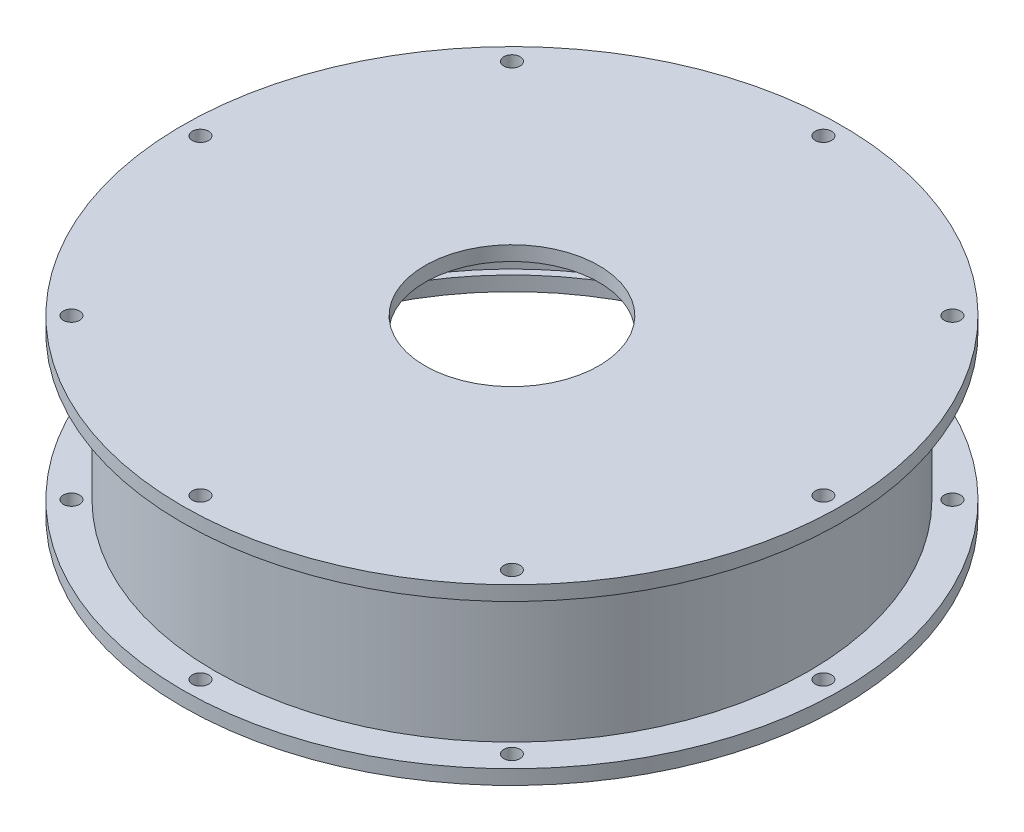
ISO-10303-21;
HEADER;
FILE_DESCRIPTION(('STEP AP214'),'2;1');
FILE_NAME('part.step','',(''),(''),'','','');
FILE_SCHEMA(('AUTOMOTIVE_DESIGN { 1 0 10303 214 1 1 1 1 }'));
ENDSEC;
DATA;
#1=APPLICATION_CONTEXT('core data for automotive mechanical design processes');
#2=APPLICATION_PROTOCOL_DEFINITION('international standard','automotive_design',2000,#1);
#3=PRODUCT_CONTEXT('',#1,'mechanical');
#4=PRODUCT('Part','Part','',(#3));
#5=PRODUCT_RELATED_PRODUCT_CATEGORY('part','',(#4));
#6=PRODUCT_DEFINITION_FORMATION('','',#4);
#7=PRODUCT_DEFINITION_CONTEXT('part definition',#1,'design');
#8=PRODUCT_DEFINITION('design','',#6,#7);
#9=PRODUCT_DEFINITION_SHAPE('','',#8);
#10=(LENGTH_UNIT() NAMED_UNIT(*) SI_UNIT(.MILLI.,.METRE.));
#11=(NAMED_UNIT(*) PLANE_ANGLE_UNIT() SI_UNIT($,.RADIAN.));
#12=(NAMED_UNIT(*) SI_UNIT($,.STERADIAN.) SOLID_ANGLE_UNIT());
#13=UNCERTAINTY_MEASURE_WITH_UNIT(LENGTH_MEASURE(1.E-05),#10,'distance_accuracy_value','');
#14=(GEOMETRIC_REPRESENTATION_CONTEXT(3) GLOBAL_UNCERTAINTY_ASSIGNED_CONTEXT((#13)) GLOBAL_UNIT_ASSIGNED_CONTEXT((#10,
#11,#12)) REPRESENTATION_CONTEXT('',''));
#15=CARTESIAN_POINT('',(0.,0.,0.));
#16=DIRECTION('',(0.,0.,1.));
#17=DIRECTION('',(1.,0.,0.));
#18=AXIS2_PLACEMENT_3D('',#15,#16,#17);
#19=CARTESIAN_POINT('',(0.,6.35,0.));
#20=DIRECTION('',(0.,-1.,0.));
#21=DIRECTION('',(0.,0.,-1.));
#22=AXIS2_PLACEMENT_3D('',#19,#20,#21);
#23=CYLINDRICAL_SURFACE('',#22,144.4625);
#24=CARTESIAN_POINT('',(0.,6.35,0.));
#25=DIRECTION('',(0.,1.,0.));
#26=DIRECTION('',(0.,0.,1.));
#27=AXIS2_PLACEMENT_3D('',#24,#25,#26);
#28=CIRCLE('',#27,144.4625);
#29=CARTESIAN_POINT('',(0.,6.35,144.4625));
#30=VERTEX_POINT('',#29);
#31=EDGE_CURVE('E52',#30,#30,#28,.T.);
#32=ORIENTED_EDGE('',*,*,#31,.F.);
#33=EDGE_LOOP('',(#32));
#34=FACE_BOUND('',#33,.T.);
#35=CARTESIAN_POINT('',(0.,0.,0.));
#36=DIRECTION('',(0.,1.,0.));
#37=DIRECTION('',(0.,0.,1.));
#38=AXIS2_PLACEMENT_3D('',#35,#36,#37);
#39=CIRCLE('',#38,144.4625);
#40=CARTESIAN_POINT('',(0.,0.,144.4625));
#41=VERTEX_POINT('',#40);
#42=EDGE_CURVE('E59',#41,#41,#39,.T.);
#43=ORIENTED_EDGE('',*,*,#42,.T.);
#44=EDGE_LOOP('',(#43));
#45=FACE_BOUND('',#44,.T.);
#46=ADVANCED_FACE('F45',(#34,#45),#23,.T.);
#47=CARTESIAN_POINT('',(0.,6.35,0.));
#48=DIRECTION('',(0.,1.,0.));
#49=DIRECTION('',(0.,0.,1.));
#50=AXIS2_PLACEMENT_3D('',#47,#48,#49);
#51=PLANE('',#50);
#52=CARTESIAN_POINT('',(0.,6.35,0.));
#53=DIRECTION('',(0.,1.,0.));
#54=DIRECTION('',(0.,0.,1.));
#55=AXIS2_PLACEMENT_3D('',#52,#53,#54);
#56=CIRCLE('',#55,130.175);
#57=CARTESIAN_POINT('',(0.,6.35,130.175));
#58=VERTEX_POINT('',#57);
#59=EDGE_CURVE('E117',#58,#58,#56,.T.);
#60=ORIENTED_EDGE('',*,*,#59,.F.);
#61=EDGE_LOOP('',(#60));
#62=FACE_BOUND('',#61,.T.);
#63=CARTESIAN_POINT('',(0.,6.35,-136.525));
#64=DIRECTION('',(0.,1.,0.));
#65=DIRECTION('',(0.,0.,1.));
#66=AXIS2_PLACEMENT_3D('',#63,#64,#65);
#67=CIRCLE('',#66,3.57124);
#68=CARTESIAN_POINT('',(0.,6.35,-132.95376));
#69=VERTEX_POINT('',#68);
#70=EDGE_CURVE('E113',#69,#69,#67,.T.);
#71=ORIENTED_EDGE('',*,*,#70,.F.);
#72=EDGE_LOOP('',(#71));
#73=FACE_BOUND('',#72,.T.);
#74=CARTESIAN_POINT('',(96.5377533014934,6.35,-96.5377533014934));
#75=DIRECTION('',(0.,1.,0.));
#76=DIRECTION('',(0.,0.,1.));
#77=AXIS2_PLACEMENT_3D('',#74,#75,#76);
#78=CIRCLE('',#77,3.57124);
#79=CARTESIAN_POINT('',(96.5377533014934,6.35,-92.9665133014934));
#80=VERTEX_POINT('',#79);
#81=EDGE_CURVE('E107',#80,#80,#78,.T.);
#82=ORIENTED_EDGE('',*,*,#81,.F.);
#83=EDGE_LOOP('',(#82));
#84=FACE_BOUND('',#83,.T.);
#85=CARTESIAN_POINT('',(136.525,6.35,0.));
#86=DIRECTION('',(0.,1.,0.));
#87=DIRECTION('',(0.,0.,1.));
#88=AXIS2_PLACEMENT_3D('',#85,#86,#87);
#89=CIRCLE('',#88,3.57124);
#90=CARTESIAN_POINT('',(136.525,6.35,3.57124));
#91=VERTEX_POINT('',#90);
#92=EDGE_CURVE('E101',#91,#91,#89,.T.);
#93=ORIENTED_EDGE('',*,*,#92,.F.);
#94=EDGE_LOOP('',(#93));
#95=FACE_BOUND('',#94,.T.);
#96=CARTESIAN_POINT('',(96.5377533014934,6.35,96.5377533014934));
#97=DIRECTION('',(0.,1.,0.));
#98=DIRECTION('',(0.,0.,1.));
#99=AXIS2_PLACEMENT_3D('',#96,#97,#98);
#100=CIRCLE('',#99,3.57124);
#101=CARTESIAN_POINT('',(96.5377533014934,6.35,100.108993301493));
#102=VERTEX_POINT('',#101);
#103=EDGE_CURVE('E95',#102,#102,#100,.T.);
#104=ORIENTED_EDGE('',*,*,#103,.F.);
#105=EDGE_LOOP('',(#104));
#106=FACE_BOUND('',#105,.T.);
#107=CARTESIAN_POINT('',(0.,6.35,136.525));
#108=DIRECTION('',(0.,1.,0.));
#109=DIRECTION('',(0.,0.,1.));
#110=AXIS2_PLACEMENT_3D('',#107,#108,#109);
#111=CIRCLE('',#110,3.57124);
#112=CARTESIAN_POINT('',(0.,6.35,140.09624));
#113=VERTEX_POINT('',#112);
#114=EDGE_CURVE('E89',#113,#113,#111,.T.);
#115=ORIENTED_EDGE('',*,*,#114,.F.);
#116=EDGE_LOOP('',(#115));
#117=FACE_BOUND('',#116,.T.);
#118=CARTESIAN_POINT('',(-96.5377533014934,6.35,96.5377533014934));
#119=DIRECTION('',(0.,1.,0.));
#120=DIRECTION('',(0.,0.,1.));
#121=AXIS2_PLACEMENT_3D('',#118,#119,#120);
#122=CIRCLE('',#121,3.57124);
#123=CARTESIAN_POINT('',(-96.5377533014934,6.35,100.108993301493));
#124=VERTEX_POINT('',#123);
#125=EDGE_CURVE('E82',#124,#124,#122,.T.);
#126=ORIENTED_EDGE('',*,*,#125,.F.);
#127=EDGE_LOOP('',(#126));
#128=FACE_BOUND('',#127,.T.);
#129=CARTESIAN_POINT('',(-136.525,6.35,0.));
#130=DIRECTION('',(0.,1.,0.));
#131=DIRECTION('',(0.,0.,1.));
#132=AXIS2_PLACEMENT_3D('',#129,#130,#131);
#133=CIRCLE('',#132,3.57124);
#134=CARTESIAN_POINT('',(-136.525,6.35,3.57124000000003));
#135=VERTEX_POINT('',#134);
#136=EDGE_CURVE('E75',#135,#135,#133,.T.);
#137=ORIENTED_EDGE('',*,*,#136,.F.);
#138=EDGE_LOOP('',(#137));
#139=FACE_BOUND('',#138,.T.);
#140=CARTESIAN_POINT('',(-96.5377533014934,6.35,-96.5377533014934));
#141=DIRECTION('',(0.,1.,0.));
#142=DIRECTION('',(0.,0.,1.));
#143=AXIS2_PLACEMENT_3D('',#140,#141,#142);
#144=CIRCLE('',#143,3.57124);
#145=CARTESIAN_POINT('',(-96.5377533014934,6.35,-92.9665133014934));
#146=VERTEX_POINT('',#145);
#147=EDGE_CURVE('E69',#146,#146,#144,.T.);
#148=ORIENTED_EDGE('',*,*,#147,.F.);
#149=EDGE_LOOP('',(#148));
#150=FACE_BOUND('',#149,.T.);
#151=ORIENTED_EDGE('',*,*,#31,.T.);
#152=EDGE_LOOP('',(#151));
#153=FACE_BOUND('',#152,.T.);
#154=ADVANCED_FACE('F243',(#62,#73,#84,#95,#106,#117,#128,#139,#150,#153),#51,.T.);
#155=CARTESIAN_POINT('',(0.,0.,0.));
#156=DIRECTION('',(0.,1.,0.));
#157=DIRECTION('',(0.,0.,1.));
#158=AXIS2_PLACEMENT_3D('',#155,#156,#157);
#159=PLANE('',#158);
#160=CARTESIAN_POINT('',(0.,0.,0.));
#161=DIRECTION('',(0.,-1.,0.));
#162=DIRECTION('',(0.,0.,-1.));
#163=AXIS2_PLACEMENT_3D('',#160,#161,#162);
#164=CIRCLE('',#163,120.65);
#165=CARTESIAN_POINT('',(0.,0.,-120.65));
#166=VERTEX_POINT('',#165);
#167=EDGE_CURVE('E190',#166,#166,#164,.T.);
#168=ORIENTED_EDGE('',*,*,#167,.F.);
#169=EDGE_LOOP('',(#168));
#170=FACE_BOUND('',#169,.T.);
#171=CARTESIAN_POINT('',(0.,0.,-136.525));
#172=DIRECTION('',(0.,1.,0.));
#173=DIRECTION('',(0.,0.,1.));
#174=AXIS2_PLACEMENT_3D('',#171,#172,#173);
#175=CIRCLE('',#174,3.57124);
#176=CARTESIAN_POINT('',(0.,0.,-132.95376));
#177=VERTEX_POINT('',#176);
#178=EDGE_CURVE('E110',#177,#177,#175,.T.);
#179=ORIENTED_EDGE('',*,*,#178,.T.);
#180=EDGE_LOOP('',(#179));
#181=FACE_BOUND('',#180,.T.);
#182=CARTESIAN_POINT('',(96.5377533014934,0.,-96.5377533014934));
#183=DIRECTION('',(0.,1.,0.));
#184=DIRECTION('',(0.,0.,1.));
#185=AXIS2_PLACEMENT_3D('',#182,#183,#184);
#186=CIRCLE('',#185,3.57124);
#187=CARTESIAN_POINT('',(96.5377533014934,0.,-92.9665133014934));
#188=VERTEX_POINT('',#187);
#189=EDGE_CURVE('E104',#188,#188,#186,.T.);
#190=ORIENTED_EDGE('',*,*,#189,.T.);
#191=EDGE_LOOP('',(#190));
#192=FACE_BOUND('',#191,.T.);
#193=CARTESIAN_POINT('',(136.525,0.,0.));
#194=DIRECTION('',(0.,1.,0.));
#195=DIRECTION('',(0.,0.,1.));
#196=AXIS2_PLACEMENT_3D('',#193,#194,#195);
#197=CIRCLE('',#196,3.57124);
#198=CARTESIAN_POINT('',(136.525,0.,3.57124));
#199=VERTEX_POINT('',#198);
#200=EDGE_CURVE('E98',#199,#199,#197,.T.);
#201=ORIENTED_EDGE('',*,*,#200,.T.);
#202=EDGE_LOOP('',(#201));
#203=FACE_BOUND('',#202,.T.);
#204=CARTESIAN_POINT('',(96.5377533014934,0.,96.5377533014934));
#205=DIRECTION('',(0.,1.,0.));
#206=DIRECTION('',(0.,0.,1.));
#207=AXIS2_PLACEMENT_3D('',#204,#205,#206);
#208=CIRCLE('',#207,3.57124);
#209=CARTESIAN_POINT('',(96.5377533014934,0.,100.108993301493));
#210=VERTEX_POINT('',#209);
#211=EDGE_CURVE('E92',#210,#210,#208,.T.);
#212=ORIENTED_EDGE('',*,*,#211,.T.);
#213=EDGE_LOOP('',(#212));
#214=FACE_BOUND('',#213,.T.);
#215=CARTESIAN_POINT('',(0.,0.,136.525));
#216=DIRECTION('',(0.,1.,0.));
#217=DIRECTION('',(0.,0.,1.));
#218=AXIS2_PLACEMENT_3D('',#215,#216,#217);
#219=CIRCLE('',#218,3.57124);
#220=CARTESIAN_POINT('',(0.,0.,140.09624));
#221=VERTEX_POINT('',#220);
#222=EDGE_CURVE('E86',#221,#221,#219,.T.);
#223=ORIENTED_EDGE('',*,*,#222,.T.);
#224=EDGE_LOOP('',(#223));
#225=FACE_BOUND('',#224,.T.);
#226=CARTESIAN_POINT('',(-96.5377533014934,0.,96.5377533014934));
#227=DIRECTION('',(0.,1.,0.));
#228=DIRECTION('',(0.,0.,1.));
#229=AXIS2_PLACEMENT_3D('',#226,#227,#228);
#230=CIRCLE('',#229,3.57124);
#231=CARTESIAN_POINT('',(-96.5377533014934,0.,100.108993301493));
#232=VERTEX_POINT('',#231);
#233=EDGE_CURVE('E78',#232,#232,#230,.T.);
#234=ORIENTED_EDGE('',*,*,#233,.T.);
#235=EDGE_LOOP('',(#234));
#236=FACE_BOUND('',#235,.T.);
#237=CARTESIAN_POINT('',(-136.525,0.,0.));
#238=DIRECTION('',(0.,1.,0.));
#239=DIRECTION('',(0.,0.,1.));
#240=AXIS2_PLACEMENT_3D('',#237,#238,#239);
#241=CIRCLE('',#240,3.57124);
#242=CARTESIAN_POINT('',(-136.525,0.,3.57124000000003));
#243=VERTEX_POINT('',#242);
#244=EDGE_CURVE('E72',#243,#243,#241,.T.);
#245=ORIENTED_EDGE('',*,*,#244,.T.);
#246=EDGE_LOOP('',(#245));
#247=FACE_BOUND('',#246,.T.);
#248=CARTESIAN_POINT('',(-96.5377533014934,0.,-96.5377533014934));
#249=DIRECTION('',(0.,1.,0.));
#250=DIRECTION('',(0.,0.,1.));
#251=AXIS2_PLACEMENT_3D('',#248,#249,#250);
#252=CIRCLE('',#251,3.57124);
#253=CARTESIAN_POINT('',(-96.5377533014934,0.,-92.9665133014934));
#254=VERTEX_POINT('',#253);
#255=EDGE_CURVE('E65',#254,#254,#252,.T.);
#256=ORIENTED_EDGE('',*,*,#255,.T.);
#257=EDGE_LOOP('',(#256));
#258=FACE_BOUND('',#257,.T.);
#259=ORIENTED_EDGE('',*,*,#42,.F.);
#260=EDGE_LOOP('',(#259));
#261=FACE_BOUND('',#260,.T.);
#262=ADVANCED_FACE('F249',(#170,#181,#192,#203,#214,#225,#236,#247,#258,#261),#159,.F.);
#263=CARTESIAN_POINT('',(-96.5377533014934,6.35,-96.5377533014934));
#264=DIRECTION('',(0.,1.,0.));
#265=DIRECTION('',(0.,0.,1.));
#266=AXIS2_PLACEMENT_3D('',#263,#264,#265);
#267=CYLINDRICAL_SURFACE('',#266,3.57124);
#268=ORIENTED_EDGE('',*,*,#255,.F.);
#269=EDGE_LOOP('',(#268));
#270=FACE_BOUND('',#269,.T.);
#271=ORIENTED_EDGE('',*,*,#147,.T.);
#272=EDGE_LOOP('',(#271));
#273=FACE_BOUND('',#272,.T.);
#274=ADVANCED_FACE('F257',(#270,#273),#267,.F.);
#275=CARTESIAN_POINT('',(-136.525,6.35,0.));
#276=DIRECTION('',(0.,1.,0.));
#277=DIRECTION('',(0.,0.,1.));
#278=AXIS2_PLACEMENT_3D('',#275,#276,#277);
#279=CYLINDRICAL_SURFACE('',#278,3.57124);
#280=ORIENTED_EDGE('',*,*,#244,.F.);
#281=EDGE_LOOP('',(#280));
#282=FACE_BOUND('',#281,.T.);
#283=ORIENTED_EDGE('',*,*,#136,.T.);
#284=EDGE_LOOP('',(#283));
#285=FACE_BOUND('',#284,.T.);
#286=ADVANCED_FACE('F263',(#282,#285),#279,.F.);
#287=CARTESIAN_POINT('',(-96.5377533014934,6.35,96.5377533014934));
#288=DIRECTION('',(0.,1.,0.));
#289=DIRECTION('',(0.,0.,1.));
#290=AXIS2_PLACEMENT_3D('',#287,#288,#289);
#291=CYLINDRICAL_SURFACE('',#290,3.57124);
#292=ORIENTED_EDGE('',*,*,#233,.F.);
#293=EDGE_LOOP('',(#292));
#294=FACE_BOUND('',#293,.T.);
#295=ORIENTED_EDGE('',*,*,#125,.T.);
#296=EDGE_LOOP('',(#295));
#297=FACE_BOUND('',#296,.T.);
#298=ADVANCED_FACE('F271',(#294,#297),#291,.F.);
#299=CARTESIAN_POINT('',(0.,6.35,136.525));
#300=DIRECTION('',(0.,1.,0.));
#301=DIRECTION('',(0.,0.,1.));
#302=AXIS2_PLACEMENT_3D('',#299,#300,#301);
#303=CYLINDRICAL_SURFACE('',#302,3.57124);
#304=ORIENTED_EDGE('',*,*,#222,.F.);
#305=EDGE_LOOP('',(#304));
#306=FACE_BOUND('',#305,.T.);
#307=ORIENTED_EDGE('',*,*,#114,.T.);
#308=EDGE_LOOP('',(#307));
#309=FACE_BOUND('',#308,.T.);
#310=ADVANCED_FACE('F275',(#306,#309),#303,.F.);
#311=CARTESIAN_POINT('',(96.5377533014934,6.35,96.5377533014934));
#312=DIRECTION('',(0.,1.,0.));
#313=DIRECTION('',(0.,0.,1.));
#314=AXIS2_PLACEMENT_3D('',#311,#312,#313);
#315=CYLINDRICAL_SURFACE('',#314,3.57124);
#316=ORIENTED_EDGE('',*,*,#211,.F.);
#317=EDGE_LOOP('',(#316));
#318=FACE_BOUND('',#317,.T.);
#319=ORIENTED_EDGE('',*,*,#103,.T.);
#320=EDGE_LOOP('',(#319));
#321=FACE_BOUND('',#320,.T.);
#322=ADVANCED_FACE('F279',(#318,#321),#315,.F.);
#323=CARTESIAN_POINT('',(136.525,6.35,0.));
#324=DIRECTION('',(0.,1.,0.));
#325=DIRECTION('',(0.,0.,1.));
#326=AXIS2_PLACEMENT_3D('',#323,#324,#325);
#327=CYLINDRICAL_SURFACE('',#326,3.57124);
#328=ORIENTED_EDGE('',*,*,#200,.F.);
#329=EDGE_LOOP('',(#328));
#330=FACE_BOUND('',#329,.T.);
#331=ORIENTED_EDGE('',*,*,#92,.T.);
#332=EDGE_LOOP('',(#331));
#333=FACE_BOUND('',#332,.T.);
#334=ADVANCED_FACE('F283',(#330,#333),#327,.F.);
#335=CARTESIAN_POINT('',(96.5377533014934,6.35,-96.5377533014934));
#336=DIRECTION('',(0.,1.,0.));
#337=DIRECTION('',(0.,0.,1.));
#338=AXIS2_PLACEMENT_3D('',#335,#336,#337);
#339=CYLINDRICAL_SURFACE('',#338,3.57124);
#340=ORIENTED_EDGE('',*,*,#189,.F.);
#341=EDGE_LOOP('',(#340));
#342=FACE_BOUND('',#341,.T.);
#343=ORIENTED_EDGE('',*,*,#81,.T.);
#344=EDGE_LOOP('',(#343));
#345=FACE_BOUND('',#344,.T.);
#346=ADVANCED_FACE('F287',(#342,#345),#339,.F.);
#347=CARTESIAN_POINT('',(0.,6.35,-136.525));
#348=DIRECTION('',(0.,1.,0.));
#349=DIRECTION('',(0.,0.,1.));
#350=AXIS2_PLACEMENT_3D('',#347,#348,#349);
#351=CYLINDRICAL_SURFACE('',#350,3.57124);
#352=ORIENTED_EDGE('',*,*,#178,.F.);
#353=EDGE_LOOP('',(#352));
#354=FACE_BOUND('',#353,.T.);
#355=ORIENTED_EDGE('',*,*,#70,.T.);
#356=EDGE_LOOP('',(#355));
#357=FACE_BOUND('',#356,.T.);
#358=ADVANCED_FACE('F238',(#354,#357),#351,.F.);
#359=CARTESIAN_POINT('',(0.,69.85,0.));
#360=DIRECTION('',(0.,-1.,0.));
#361=DIRECTION('',(0.,0.,-1.));
#362=AXIS2_PLACEMENT_3D('',#359,#360,#361);
#363=CYLINDRICAL_SURFACE('',#362,130.175);
#364=CARTESIAN_POINT('',(0.,69.85,0.));
#365=DIRECTION('',(0.,1.,0.));
#366=DIRECTION('',(0.,0.,1.));
#367=AXIS2_PLACEMENT_3D('',#364,#365,#366);
#368=CIRCLE('',#367,130.175);
#369=CARTESIAN_POINT('',(0.,69.85,130.175));
#370=VERTEX_POINT('',#369);
#371=EDGE_CURVE('E116',#370,#370,#368,.T.);
#372=ORIENTED_EDGE('',*,*,#371,.F.);
#373=EDGE_LOOP('',(#372));
#374=FACE_BOUND('',#373,.T.);
#375=ORIENTED_EDGE('',*,*,#59,.T.);
#376=EDGE_LOOP('',(#375));
#377=FACE_BOUND('',#376,.T.);
#378=ADVANCED_FACE('F228',(#374,#377),#363,.T.);
#379=CARTESIAN_POINT('',(0.,69.85,0.));
#380=DIRECTION('',(0.,1.,0.));
#381=DIRECTION('',(0.,0.,1.));
#382=AXIS2_PLACEMENT_3D('',#379,#380,#381);
#383=CYLINDRICAL_SURFACE('',#382,144.4625);
#384=CARTESIAN_POINT('',(0.,69.85,0.));
#385=DIRECTION('',(0.,1.,0.));
#386=DIRECTION('',(0.,0.,1.));
#387=AXIS2_PLACEMENT_3D('',#384,#385,#386);
#388=CIRCLE('',#387,144.4625);
#389=CARTESIAN_POINT('',(0.,69.85,144.4625));
#390=VERTEX_POINT('',#389);
#391=EDGE_CURVE('E127',#390,#390,#388,.T.);
#392=ORIENTED_EDGE('',*,*,#391,.T.);
#393=EDGE_LOOP('',(#392));
#394=FACE_BOUND('',#393,.T.);
#395=CARTESIAN_POINT('',(0.,76.2,0.));
#396=DIRECTION('',(0.,1.,0.));
#397=DIRECTION('',(0.,0.,1.));
#398=AXIS2_PLACEMENT_3D('',#395,#396,#397);
#399=CIRCLE('',#398,144.4625);
#400=CARTESIAN_POINT('',(0.,76.2,144.4625));
#401=VERTEX_POINT('',#400);
#402=EDGE_CURVE('E128',#401,#401,#399,.T.);
#403=ORIENTED_EDGE('',*,*,#402,.F.);
#404=EDGE_LOOP('',(#403));
#405=FACE_BOUND('',#404,.T.);
#406=ADVANCED_FACE('F226',(#394,#405),#383,.T.);
#407=CARTESIAN_POINT('',(0.,69.85,0.));
#408=DIRECTION('',(0.,-1.,0.));
#409=DIRECTION('',(0.,0.,1.));
#410=AXIS2_PLACEMENT_3D('',#407,#408,#409);
#411=PLANE('',#410);
#412=CARTESIAN_POINT('',(0.,69.85,-136.525));
#413=DIRECTION('',(0.,-1.,0.));
#414=DIRECTION('',(0.,0.,-1.));
#415=AXIS2_PLACEMENT_3D('',#412,#413,#414);
#416=CIRCLE('',#415,3.57124);
#417=CARTESIAN_POINT('',(0.,69.85,-140.09624));
#418=VERTEX_POINT('',#417);
#419=EDGE_CURVE('E183',#418,#418,#416,.T.);
#420=ORIENTED_EDGE('',*,*,#419,.F.);
#421=EDGE_LOOP('',(#420));
#422=FACE_BOUND('',#421,.T.);
#423=CARTESIAN_POINT('',(96.5377533014934,69.85,-96.5377533014934));
#424=DIRECTION('',(0.,-1.,0.));
#425=DIRECTION('',(0.,0.,-1.));
#426=AXIS2_PLACEMENT_3D('',#423,#424,#425);
#427=CIRCLE('',#426,3.57124);
#428=CARTESIAN_POINT('',(96.5377533014934,69.85,-100.108993301493));
#429=VERTEX_POINT('',#428);
#430=EDGE_CURVE('E177',#429,#429,#427,.T.);
#431=ORIENTED_EDGE('',*,*,#430,.F.);
#432=EDGE_LOOP('',(#431));
#433=FACE_BOUND('',#432,.T.);
#434=CARTESIAN_POINT('',(136.525,69.85,0.));
#435=DIRECTION('',(0.,-1.,0.));
#436=DIRECTION('',(0.,0.,-1.));
#437=AXIS2_PLACEMENT_3D('',#434,#435,#436);
#438=CIRCLE('',#437,3.57124);
#439=CARTESIAN_POINT('',(136.525,69.85,-3.57124000000001));
#440=VERTEX_POINT('',#439);
#441=EDGE_CURVE('E171',#440,#440,#438,.T.);
#442=ORIENTED_EDGE('',*,*,#441,.F.);
#443=EDGE_LOOP('',(#442));
#444=FACE_BOUND('',#443,.T.);
#445=CARTESIAN_POINT('',(96.5377533014934,69.85,96.5377533014934));
#446=DIRECTION('',(0.,-1.,0.));
#447=DIRECTION('',(0.,0.,-1.));
#448=AXIS2_PLACEMENT_3D('',#445,#446,#447);
#449=CIRCLE('',#448,3.57124);
#450=CARTESIAN_POINT('',(96.5377533014934,69.85,92.9665133014934));
#451=VERTEX_POINT('',#450);
#452=EDGE_CURVE('E165',#451,#451,#449,.T.);
#453=ORIENTED_EDGE('',*,*,#452,.F.);
#454=EDGE_LOOP('',(#453));
#455=FACE_BOUND('',#454,.T.);
#456=CARTESIAN_POINT('',(0.,69.85,136.525));
#457=DIRECTION('',(0.,-1.,0.));
#458=DIRECTION('',(0.,0.,-1.));
#459=AXIS2_PLACEMENT_3D('',#456,#457,#458);
#460=CIRCLE('',#459,3.57124);
#461=CARTESIAN_POINT('',(0.,69.85,132.95376));
#462=VERTEX_POINT('',#461);
#463=EDGE_CURVE('E159',#462,#462,#460,.T.);
#464=ORIENTED_EDGE('',*,*,#463,.F.);
#465=EDGE_LOOP('',(#464));
#466=FACE_BOUND('',#465,.T.);
#467=CARTESIAN_POINT('',(-96.5377533014934,69.85,96.5377533014934));
#468=DIRECTION('',(0.,-1.,0.));
#469=DIRECTION('',(0.,0.,-1.));
#470=AXIS2_PLACEMENT_3D('',#467,#468,#469);
#471=CIRCLE('',#470,3.57124);
#472=CARTESIAN_POINT('',(-96.5377533014934,69.85,92.9665133014934));
#473=VERTEX_POINT('',#472);
#474=EDGE_CURVE('E153',#473,#473,#471,.T.);
#475=ORIENTED_EDGE('',*,*,#474,.F.);
#476=EDGE_LOOP('',(#475));
#477=FACE_BOUND('',#476,.T.);
#478=CARTESIAN_POINT('',(-136.525,69.85,0.));
#479=DIRECTION('',(0.,-1.,0.));
#480=DIRECTION('',(0.,0.,-1.));
#481=AXIS2_PLACEMENT_3D('',#478,#479,#480);
#482=CIRCLE('',#481,3.57124);
#483=CARTESIAN_POINT('',(-136.525,69.85,-3.57123999999998));
#484=VERTEX_POINT('',#483);
#485=EDGE_CURVE('E146',#484,#484,#482,.T.);
#486=ORIENTED_EDGE('',*,*,#485,.F.);
#487=EDGE_LOOP('',(#486));
#488=FACE_BOUND('',#487,.T.);
#489=CARTESIAN_POINT('',(-96.5377533014934,69.85,-96.5377533014934));
#490=DIRECTION('',(0.,-1.,0.));
#491=DIRECTION('',(0.,0.,-1.));
#492=AXIS2_PLACEMENT_3D('',#489,#490,#491);
#493=CIRCLE('',#492,3.57124);
#494=CARTESIAN_POINT('',(-96.5377533014934,69.85,-100.108993301493));
#495=VERTEX_POINT('',#494);
#496=EDGE_CURVE('E139',#495,#495,#493,.T.);
#497=ORIENTED_EDGE('',*,*,#496,.F.);
#498=EDGE_LOOP('',(#497));
#499=FACE_BOUND('',#498,.T.);
#500=ORIENTED_EDGE('',*,*,#371,.T.);
#501=EDGE_LOOP('',(#500));
#502=FACE_BOUND('',#501,.T.);
#503=ORIENTED_EDGE('',*,*,#391,.F.);
#504=EDGE_LOOP('',(#503));
#505=FACE_BOUND('',#504,.T.);
#506=ADVANCED_FACE('F206',(#422,#433,#444,#455,#466,#477,#488,#499,#502,#505),#411,.T.);
#507=CARTESIAN_POINT('',(0.,76.2,0.));
#508=DIRECTION('',(0.,-1.,0.));
#509=DIRECTION('',(0.,0.,1.));
#510=AXIS2_PLACEMENT_3D('',#507,#508,#509);
#511=PLANE('',#510);
#512=CARTESIAN_POINT('',(0.,76.2,0.));
#513=DIRECTION('',(0.,1.,0.));
#514=DIRECTION('',(0.,0.,1.));
#515=AXIS2_PLACEMENT_3D('',#512,#513,#514);
#516=CIRCLE('',#515,38.1);
#517=CARTESIAN_POINT('',(0.,76.2,38.1));
#518=VERTEX_POINT('',#517);
#519=EDGE_CURVE('E193',#518,#518,#516,.T.);
#520=ORIENTED_EDGE('',*,*,#519,.F.);
#521=EDGE_LOOP('',(#520));
#522=FACE_BOUND('',#521,.T.);
#523=CARTESIAN_POINT('',(0.,76.2,-136.525));
#524=DIRECTION('',(0.,-1.,0.));
#525=DIRECTION('',(0.,0.,-1.));
#526=AXIS2_PLACEMENT_3D('',#523,#524,#525);
#527=CIRCLE('',#526,3.57124);
#528=CARTESIAN_POINT('',(0.,76.2,-140.09624));
#529=VERTEX_POINT('',#528);
#530=EDGE_CURVE('E180',#529,#529,#527,.T.);
#531=ORIENTED_EDGE('',*,*,#530,.T.);
#532=EDGE_LOOP('',(#531));
#533=FACE_BOUND('',#532,.T.);
#534=CARTESIAN_POINT('',(96.5377533014934,76.2,-96.5377533014934));
#535=DIRECTION('',(0.,-1.,0.));
#536=DIRECTION('',(0.,0.,-1.));
#537=AXIS2_PLACEMENT_3D('',#534,#535,#536);
#538=CIRCLE('',#537,3.57124);
#539=CARTESIAN_POINT('',(96.5377533014934,76.2,-100.108993301493));
#540=VERTEX_POINT('',#539);
#541=EDGE_CURVE('E174',#540,#540,#538,.T.);
#542=ORIENTED_EDGE('',*,*,#541,.T.);
#543=EDGE_LOOP('',(#542));
#544=FACE_BOUND('',#543,.T.);
#545=CARTESIAN_POINT('',(136.525,76.2,0.));
#546=DIRECTION('',(0.,-1.,0.));
#547=DIRECTION('',(0.,0.,-1.));
#548=AXIS2_PLACEMENT_3D('',#545,#546,#547);
#549=CIRCLE('',#548,3.57124);
#550=CARTESIAN_POINT('',(136.525,76.2,-3.57124000000001));
#551=VERTEX_POINT('',#550);
#552=EDGE_CURVE('E168',#551,#551,#549,.T.);
#553=ORIENTED_EDGE('',*,*,#552,.T.);
#554=EDGE_LOOP('',(#553));
#555=FACE_BOUND('',#554,.T.);
#556=CARTESIAN_POINT('',(96.5377533014934,76.2,96.5377533014934));
#557=DIRECTION('',(0.,-1.,0.));
#558=DIRECTION('',(0.,0.,-1.));
#559=AXIS2_PLACEMENT_3D('',#556,#557,#558);
#560=CIRCLE('',#559,3.57124);
#561=CARTESIAN_POINT('',(96.5377533014934,76.2,92.9665133014934));
#562=VERTEX_POINT('',#561);
#563=EDGE_CURVE('E162',#562,#562,#560,.T.);
#564=ORIENTED_EDGE('',*,*,#563,.T.);
#565=EDGE_LOOP('',(#564));
#566=FACE_BOUND('',#565,.T.);
#567=CARTESIAN_POINT('',(0.,76.2,136.525));
#568=DIRECTION('',(0.,-1.,0.));
#569=DIRECTION('',(0.,0.,-1.));
#570=AXIS2_PLACEMENT_3D('',#567,#568,#569);
#571=CIRCLE('',#570,3.57124);
#572=CARTESIAN_POINT('',(0.,76.2,132.95376));
#573=VERTEX_POINT('',#572);
#574=EDGE_CURVE('E156',#573,#573,#571,.T.);
#575=ORIENTED_EDGE('',*,*,#574,.T.);
#576=EDGE_LOOP('',(#575));
#577=FACE_BOUND('',#576,.T.);
#578=CARTESIAN_POINT('',(-96.5377533014934,76.2,96.5377533014934));
#579=DIRECTION('',(0.,-1.,0.));
#580=DIRECTION('',(0.,0.,-1.));
#581=AXIS2_PLACEMENT_3D('',#578,#579,#580);
#582=CIRCLE('',#581,3.57124);
#583=CARTESIAN_POINT('',(-96.5377533014934,76.2,92.9665133014934));
#584=VERTEX_POINT('',#583);
#585=EDGE_CURVE('E150',#584,#584,#582,.T.);
#586=ORIENTED_EDGE('',*,*,#585,.T.);
#587=EDGE_LOOP('',(#586));
#588=FACE_BOUND('',#587,.T.);
#589=CARTESIAN_POINT('',(-136.525,76.2,0.));
#590=DIRECTION('',(0.,-1.,0.));
#591=DIRECTION('',(0.,0.,-1.));
#592=AXIS2_PLACEMENT_3D('',#589,#590,#591);
#593=CIRCLE('',#592,3.57124);
#594=CARTESIAN_POINT('',(-136.525,76.2,-3.57123999999998));
#595=VERTEX_POINT('',#594);
#596=EDGE_CURVE('E142',#595,#595,#593,.T.);
#597=ORIENTED_EDGE('',*,*,#596,.T.);
#598=EDGE_LOOP('',(#597));
#599=FACE_BOUND('',#598,.T.);
#600=CARTESIAN_POINT('',(-96.5377533014934,76.2,-96.5377533014934));
#601=DIRECTION('',(0.,-1.,0.));
#602=DIRECTION('',(0.,0.,-1.));
#603=AXIS2_PLACEMENT_3D('',#600,#601,#602);
#604=CIRCLE('',#603,3.57124);
#605=CARTESIAN_POINT('',(-96.5377533014934,76.2,-100.108993301493));
#606=VERTEX_POINT('',#605);
#607=EDGE_CURVE('E132',#606,#606,#604,.T.);
#608=ORIENTED_EDGE('',*,*,#607,.T.);
#609=EDGE_LOOP('',(#608));
#610=FACE_BOUND('',#609,.T.);
#611=ORIENTED_EDGE('',*,*,#402,.T.);
#612=EDGE_LOOP('',(#611));
#613=FACE_BOUND('',#612,.T.);
#614=ADVANCED_FACE('F202',(#522,#533,#544,#555,#566,#577,#588,#599,#610,#613),#511,.F.);
#615=CARTESIAN_POINT('',(-96.5377533014934,69.85,-96.5377533014934));
#616=DIRECTION('',(0.,-1.,0.));
#617=DIRECTION('',(0.,0.,-1.));
#618=AXIS2_PLACEMENT_3D('',#615,#616,#617);
#619=CYLINDRICAL_SURFACE('',#618,3.57124);
#620=ORIENTED_EDGE('',*,*,#607,.F.);
#621=EDGE_LOOP('',(#620));
#622=FACE_BOUND('',#621,.T.);
#623=ORIENTED_EDGE('',*,*,#496,.T.);
#624=EDGE_LOOP('',(#623));
#625=FACE_BOUND('',#624,.T.);
#626=ADVANCED_FACE('F205',(#622,#625),#619,.F.);
#627=CARTESIAN_POINT('',(-136.525,69.85,0.));
#628=DIRECTION('',(0.,-1.,0.));
#629=DIRECTION('',(0.,0.,-1.));
#630=AXIS2_PLACEMENT_3D('',#627,#628,#629);
#631=CYLINDRICAL_SURFACE('',#630,3.57124);
#632=ORIENTED_EDGE('',*,*,#596,.F.);
#633=EDGE_LOOP('',(#632));
#634=FACE_BOUND('',#633,.T.);
#635=ORIENTED_EDGE('',*,*,#485,.T.);
#636=EDGE_LOOP('',(#635));
#637=FACE_BOUND('',#636,.T.);
#638=ADVANCED_FACE('F338',(#634,#637),#631,.F.);
#639=CARTESIAN_POINT('',(-96.5377533014934,69.85,96.5377533014934));
#640=DIRECTION('',(0.,-1.,0.));
#641=DIRECTION('',(0.,0.,-1.));
#642=AXIS2_PLACEMENT_3D('',#639,#640,#641);
#643=CYLINDRICAL_SURFACE('',#642,3.57124);
#644=ORIENTED_EDGE('',*,*,#585,.F.);
#645=EDGE_LOOP('',(#644));
#646=FACE_BOUND('',#645,.T.);
#647=ORIENTED_EDGE('',*,*,#474,.T.);
#648=EDGE_LOOP('',(#647));
#649=FACE_BOUND('',#648,.T.);
#650=ADVANCED_FACE('F334',(#646,#649),#643,.F.);
#651=CARTESIAN_POINT('',(0.,69.85,136.525));
#652=DIRECTION('',(0.,-1.,0.));
#653=DIRECTION('',(0.,0.,-1.));
#654=AXIS2_PLACEMENT_3D('',#651,#652,#653);
#655=CYLINDRICAL_SURFACE('',#654,3.57124);
#656=ORIENTED_EDGE('',*,*,#574,.F.);
#657=EDGE_LOOP('',(#656));
#658=FACE_BOUND('',#657,.T.);
#659=ORIENTED_EDGE('',*,*,#463,.T.);
#660=EDGE_LOOP('',(#659));
#661=FACE_BOUND('',#660,.T.);
#662=ADVANCED_FACE('F330',(#658,#661),#655,.F.);
#663=CARTESIAN_POINT('',(96.5377533014934,69.85,96.5377533014934));
#664=DIRECTION('',(0.,-1.,0.));
#665=DIRECTION('',(0.,0.,-1.));
#666=AXIS2_PLACEMENT_3D('',#663,#664,#665);
#667=CYLINDRICAL_SURFACE('',#666,3.57124);
#668=ORIENTED_EDGE('',*,*,#563,.F.);
#669=EDGE_LOOP('',(#668));
#670=FACE_BOUND('',#669,.T.);
#671=ORIENTED_EDGE('',*,*,#452,.T.);
#672=EDGE_LOOP('',(#671));
#673=FACE_BOUND('',#672,.T.);
#674=ADVANCED_FACE('F326',(#670,#673),#667,.F.);
#675=CARTESIAN_POINT('',(136.525,69.85,0.));
#676=DIRECTION('',(0.,-1.,0.));
#677=DIRECTION('',(0.,0.,-1.));
#678=AXIS2_PLACEMENT_3D('',#675,#676,#677);
#679=CYLINDRICAL_SURFACE('',#678,3.57124);
#680=ORIENTED_EDGE('',*,*,#552,.F.);
#681=EDGE_LOOP('',(#680));
#682=FACE_BOUND('',#681,.T.);
#683=ORIENTED_EDGE('',*,*,#441,.T.);
#684=EDGE_LOOP('',(#683));
#685=FACE_BOUND('',#684,.T.);
#686=ADVANCED_FACE('F322',(#682,#685),#679,.F.);
#687=CARTESIAN_POINT('',(96.5377533014934,69.85,-96.5377533014934));
#688=DIRECTION('',(0.,-1.,0.));
#689=DIRECTION('',(0.,0.,-1.));
#690=AXIS2_PLACEMENT_3D('',#687,#688,#689);
#691=CYLINDRICAL_SURFACE('',#690,3.57124);
#692=ORIENTED_EDGE('',*,*,#541,.F.);
#693=EDGE_LOOP('',(#692));
#694=FACE_BOUND('',#693,.T.);
#695=ORIENTED_EDGE('',*,*,#430,.T.);
#696=EDGE_LOOP('',(#695));
#697=FACE_BOUND('',#696,.T.);
#698=ADVANCED_FACE('F315',(#694,#697),#691,.F.);
#699=CARTESIAN_POINT('',(0.,69.85,-136.525));
#700=DIRECTION('',(0.,-1.,0.));
#701=DIRECTION('',(0.,0.,-1.));
#702=AXIS2_PLACEMENT_3D('',#699,#700,#701);
#703=CYLINDRICAL_SURFACE('',#702,3.57124);
#704=ORIENTED_EDGE('',*,*,#530,.F.);
#705=EDGE_LOOP('',(#704));
#706=FACE_BOUND('',#705,.T.);
#707=ORIENTED_EDGE('',*,*,#419,.T.);
#708=EDGE_LOOP('',(#707));
#709=FACE_BOUND('',#708,.T.);
#710=ADVANCED_FACE('F307',(#706,#709),#703,.F.);
#711=CARTESIAN_POINT('',(0.,69.85,0.));
#712=DIRECTION('',(0.,-1.,0.));
#713=DIRECTION('',(0.,0.,-1.));
#714=AXIS2_PLACEMENT_3D('',#711,#712,#713);
#715=CYLINDRICAL_SURFACE('',#714,120.65);
#716=CARTESIAN_POINT('',(0.,6.34999999999999,0.));
#717=DIRECTION('',(0.,1.,0.));
#718=DIRECTION('',(0.,0.,1.));
#719=AXIS2_PLACEMENT_3D('',#716,#717,#718);
#720=CIRCLE('',#719,120.65);
#721=CARTESIAN_POINT('',(0.,6.34999999999999,120.65));
#722=VERTEX_POINT('',#721);
#723=EDGE_CURVE('E186',#722,#722,#720,.T.);
#724=ORIENTED_EDGE('',*,*,#723,.T.);
#725=EDGE_LOOP('',(#724));
#726=FACE_BOUND('',#725,.T.);
#727=ORIENTED_EDGE('',*,*,#167,.T.);
#728=EDGE_LOOP('',(#727));
#729=FACE_BOUND('',#728,.T.);
#730=ADVANCED_FACE('F300',(#726,#729),#715,.F.);
#731=ORIENTED_EDGE('',*,*,#723,.F.);
#732=EDGE_LOOP('',(#731));
#733=FACE_BOUND('',#732,.T.);
#734=CARTESIAN_POINT('',(0.,6.34999999999999,0.));
#735=DIRECTION('',(0.,1.,0.));
#736=DIRECTION('',(0.,0.,1.));
#737=AXIS2_PLACEMENT_3D('',#734,#735,#736);
#738=CIRCLE('',#737,123.825);
#739=CARTESIAN_POINT('',(0.,6.34999999999999,123.825));
#740=VERTEX_POINT('',#739);
#741=EDGE_CURVE('E10',#740,#740,#738,.F.);
#742=ORIENTED_EDGE('',*,*,#741,.F.);
#743=EDGE_LOOP('',(#742));
#744=FACE_BOUND('',#743,.T.);
#745=ADVANCED_FACE('F252',(#733,#744),#51,.T.);
#746=CARTESIAN_POINT('',(0.,69.85,0.));
#747=DIRECTION('',(0.,-1.,0.));
#748=DIRECTION('',(0.,0.,-1.));
#749=AXIS2_PLACEMENT_3D('',#746,#747,#748);
#750=CYLINDRICAL_SURFACE('',#749,123.825);
#751=CARTESIAN_POINT('',(0.,69.85,0.));
#752=DIRECTION('',(0.,1.,0.));
#753=DIRECTION('',(0.,0.,1.));
#754=AXIS2_PLACEMENT_3D('',#751,#752,#753);
#755=CIRCLE('',#754,123.825);
#756=CARTESIAN_POINT('',(0.,69.85,123.825));
#757=VERTEX_POINT('',#756);
#758=EDGE_CURVE('E120',#757,#757,#755,.T.);
#759=ORIENTED_EDGE('',*,*,#758,.T.);
#760=EDGE_LOOP('',(#759));
#761=FACE_BOUND('',#760,.T.);
#762=ORIENTED_EDGE('',*,*,#741,.T.);
#763=EDGE_LOOP('',(#762));
#764=FACE_BOUND('',#763,.T.);
#765=ADVANCED_FACE('F294',(#761,#764),#750,.F.);
#766=CARTESIAN_POINT('',(0.,69.85,0.));
#767=DIRECTION('',(0.,-1.,0.));
#768=DIRECTION('',(0.,0.,-1.));
#769=AXIS2_PLACEMENT_3D('',#766,#767,#768);
#770=CIRCLE('',#769,38.1);
#771=CARTESIAN_POINT('',(0.,69.85,38.1));
#772=VERTEX_POINT('',#771);
#773=EDGE_CURVE('E194',#772,#772,#770,.F.);
#774=ORIENTED_EDGE('',*,*,#773,.T.);
#775=EDGE_LOOP('',(#774));
#776=FACE_BOUND('',#775,.T.);
#777=ORIENTED_EDGE('',*,*,#758,.F.);
#778=EDGE_LOOP('',(#777));
#779=FACE_BOUND('',#778,.T.);
#780=ADVANCED_FACE('F237',(#776,#779),#411,.T.);
#781=CARTESIAN_POINT('',(0.,-0.001000000000001,0.));
#782=DIRECTION('',(0.,1.,0.));
#783=DIRECTION('',(0.,0.,1.));
#784=AXIS2_PLACEMENT_3D('',#781,#782,#783);
#785=CYLINDRICAL_SURFACE('',#784,38.1);
#786=CARTESIAN_POINT('',(0.,69.85,38.1));
#787=CARTESIAN_POINT('',(0.,69.9161458333333,38.1));
#788=CARTESIAN_POINT('',(0.,69.9822916666667,38.1));
#789=CARTESIAN_POINT('',(0.,70.1145833333333,38.1));
#790=CARTESIAN_POINT('',(0.,70.1807291666667,38.1));
#791=CARTESIAN_POINT('',(0.,70.3130208333333,38.1));
#792=CARTESIAN_POINT('',(0.,70.3791666666667,38.1));
#793=CARTESIAN_POINT('',(0.,70.5114583333334,38.1));
#794=CARTESIAN_POINT('',(0.,70.5776041666667,38.1));
#795=CARTESIAN_POINT('',(0.,70.7098958333333,38.1));
#796=CARTESIAN_POINT('',(0.,70.7760416666667,38.1));
#797=CARTESIAN_POINT('',(0.,70.9083333333333,38.1));
#798=CARTESIAN_POINT('',(0.,70.9744791666667,38.1));
#799=CARTESIAN_POINT('',(0.,71.1067708333333,38.1));
#800=CARTESIAN_POINT('',(0.,71.1729166666667,38.1));
#801=CARTESIAN_POINT('',(0.,71.3052083333333,38.1));
#802=CARTESIAN_POINT('',(0.,71.3713541666667,38.1));
#803=CARTESIAN_POINT('',(0.,71.5036458333333,38.1));
#804=CARTESIAN_POINT('',(0.,71.5697916666667,38.1));
#805=CARTESIAN_POINT('',(0.,71.7020833333333,38.1));
#806=CARTESIAN_POINT('',(0.,71.7682291666667,38.1));
#807=CARTESIAN_POINT('',(0.,71.9005208333333,38.1));
#808=CARTESIAN_POINT('',(0.,71.9666666666667,38.1));
#809=CARTESIAN_POINT('',(0.,72.0989583333333,38.1));
#810=CARTESIAN_POINT('',(0.,72.1651041666667,38.1));
#811=CARTESIAN_POINT('',(0.,72.2973958333333,38.1));
#812=CARTESIAN_POINT('',(0.,72.3635416666667,38.1));
#813=CARTESIAN_POINT('',(0.,72.4958333333333,38.1));
#814=CARTESIAN_POINT('',(0.,72.5619791666667,38.1));
#815=CARTESIAN_POINT('',(0.,72.6942708333333,38.1));
#816=CARTESIAN_POINT('',(0.,72.7604166666667,38.1));
#817=CARTESIAN_POINT('',(0.,72.8927083333333,38.1));
#818=CARTESIAN_POINT('',(0.,72.9588541666667,38.1));
#819=CARTESIAN_POINT('',(0.,73.0911458333333,38.1));
#820=CARTESIAN_POINT('',(0.,73.1572916666667,38.1));
#821=CARTESIAN_POINT('',(0.,73.2895833333333,38.1));
#822=CARTESIAN_POINT('',(0.,73.3557291666666,38.1));
#823=CARTESIAN_POINT('',(0.,73.4880208333333,38.1));
#824=CARTESIAN_POINT('',(0.,73.5541666666667,38.1));
#825=CARTESIAN_POINT('',(0.,73.6864583333333,38.1));
#826=CARTESIAN_POINT('',(0.,73.7526041666667,38.1));
#827=CARTESIAN_POINT('',(0.,73.8848958333333,38.1));
#828=CARTESIAN_POINT('',(0.,73.9510416666667,38.1));
#829=CARTESIAN_POINT('',(0.,74.0833333333333,38.1));
#830=CARTESIAN_POINT('',(0.,74.1494791666667,38.1));
#831=CARTESIAN_POINT('',(0.,74.2817708333333,38.1));
#832=CARTESIAN_POINT('',(0.,74.3479166666666,38.1));
#833=CARTESIAN_POINT('',(0.,74.4802083333333,38.1));
#834=CARTESIAN_POINT('',(0.,74.5463541666666,38.1));
#835=CARTESIAN_POINT('',(0.,74.6786458333333,38.1));
#836=CARTESIAN_POINT('',(0.,74.7447916666666,38.1));
#837=CARTESIAN_POINT('',(0.,74.8770833333333,38.1));
#838=CARTESIAN_POINT('',(0.,74.9432291666666,38.1));
#839=CARTESIAN_POINT('',(0.,75.0755208333333,38.1));
#840=CARTESIAN_POINT('',(0.,75.1416666666667,38.1));
#841=CARTESIAN_POINT('',(0.,75.2739583333333,38.1));
#842=CARTESIAN_POINT('',(0.,75.3401041666666,38.1));
#843=CARTESIAN_POINT('',(0.,75.4723958333333,38.1));
#844=CARTESIAN_POINT('',(0.,75.5385416666666,38.1));
#845=CARTESIAN_POINT('',(0.,75.6708333333333,38.1));
#846=CARTESIAN_POINT('',(0.,75.7369791666666,38.1));
#847=CARTESIAN_POINT('',(0.,75.8692708333333,38.1));
#848=CARTESIAN_POINT('',(0.,75.9354166666666,38.1));
#849=CARTESIAN_POINT('',(0.,76.0677083333333,38.1));
#850=CARTESIAN_POINT('',(0.,76.1338541666666,38.1));
#851=CARTESIAN_POINT('',(0.,76.2,38.1));
#852=B_SPLINE_CURVE_WITH_KNOTS('',3,(#786,#787,#788,#789,#790,#791,#792,#793,#794,#795,#796,
#797,#798,#799,#800,#801,#802,#803,#804,#805,#806,#807,#808,#809,#810,#811,#812,#813,#814,#815,
#816,#817,#818,#819,#820,#821,#822,#823,#824,#825,#826,#827,#828,#829,#830,#831,#832,#833,#834,
#835,#836,#837,#838,#839,#840,#841,#842,#843,#844,#845,#846,#847,#848,#849,#850,#851),
.UNSPECIFIED.,.F.,.F.,(4,2,2,2,2,2,2,2,2,2,2,2,2,2,2,2,2,2,2,2,2,2,2,2,2,2,2,2,2,2,2,2,4),(0.,
0.198437499999995,0.396874999999991,0.5953125,0.793749999999996,0.992187499999991,1.190625,
1.3890625,1.58749999999999,1.78593749999999,1.98437499999998,2.18281249999999,2.38124999999999,
2.57968749999998,2.77812499999999,2.97656249999999,3.17499999999998,3.37343749999998,
3.57187499999997,3.77031249999998,3.96874999999998,4.16718749999997,4.36562499999998,
4.56406249999998,4.76249999999998,4.96093749999997,5.15937499999997,5.35781249999998,
5.55624999999997,5.75468749999997,5.95312499999998,6.15156249999997,6.34999999999997),.UNSPECIFIED.);
#853=EDGE_CURVE('BSEAM200',#772,#518,#852,.T.);
#854=ORIENTED_EDGE('',*,*,#773,.F.);
#855=ORIENTED_EDGE('',*,*,#519,.T.);
#856=ORIENTED_EDGE('',*,*,#853,.T.);
#857=ORIENTED_EDGE('',*,*,#853,.F.);
#858=EDGE_LOOP('',(#854,#856,#855,#857));
#859=FACE_BOUND('',#858,.T.);
#860=ADVANCED_FACE('F200',(#859),#785,.F.);
#861=CLOSED_SHELL('',(#46,#154,#262,#274,#286,#298,#310,#322,#334,#346,#358,#378,#406,#506,#614,
#626,#638,#650,#662,#674,#686,#698,#710,#730,#745,#765,#780,#860));
#862=MANIFOLD_SOLID_BREP('B2',#861);
#863=ADVANCED_BREP_SHAPE_REPRESENTATION('',(#18,#862),#14);
#864=SHAPE_DEFINITION_REPRESENTATION(#9,#863);
ENDSEC;
END-ISO-10303-21;
